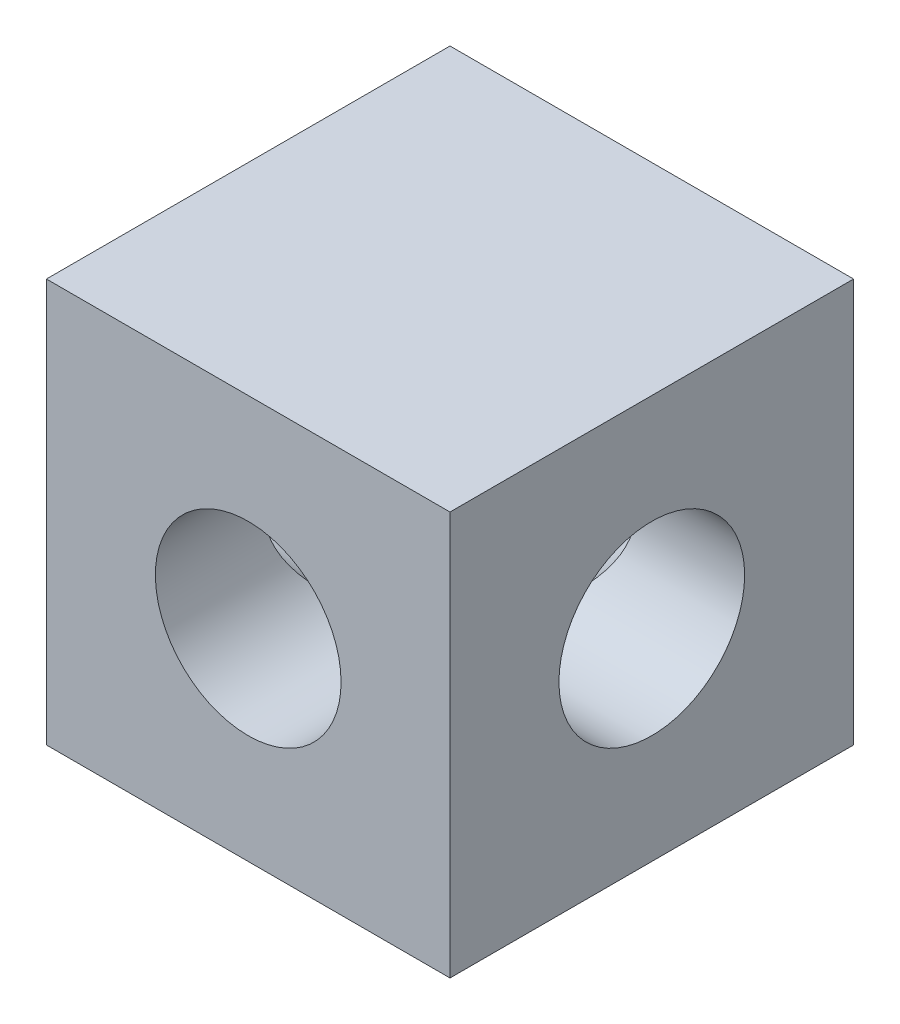
ISO-10303-21;
HEADER;
FILE_DESCRIPTION(('STEP AP214'),'2;1');
FILE_NAME('part.step','',(''),(''),'','','');
FILE_SCHEMA(('AUTOMOTIVE_DESIGN { 1 0 10303 214 1 1 1 1 }'));
ENDSEC;
DATA;
#1=APPLICATION_CONTEXT('core data for automotive mechanical design processes');
#2=APPLICATION_PROTOCOL_DEFINITION('international standard','automotive_design',2000,#1);
#3=PRODUCT_CONTEXT('',#1,'mechanical');
#4=PRODUCT('Part','Part','',(#3));
#5=PRODUCT_RELATED_PRODUCT_CATEGORY('part','',(#4));
#6=PRODUCT_DEFINITION_FORMATION('','',#4);
#7=PRODUCT_DEFINITION_CONTEXT('part definition',#1,'design');
#8=PRODUCT_DEFINITION('design','',#6,#7);
#9=PRODUCT_DEFINITION_SHAPE('','',#8);
#10=(LENGTH_UNIT() NAMED_UNIT(*) SI_UNIT(.MILLI.,.METRE.));
#11=(NAMED_UNIT(*) PLANE_ANGLE_UNIT() SI_UNIT($,.RADIAN.));
#12=(NAMED_UNIT(*) SI_UNIT($,.STERADIAN.) SOLID_ANGLE_UNIT());
#13=UNCERTAINTY_MEASURE_WITH_UNIT(LENGTH_MEASURE(1.E-05),#10,'distance_accuracy_value','');
#14=(GEOMETRIC_REPRESENTATION_CONTEXT(3) GLOBAL_UNCERTAINTY_ASSIGNED_CONTEXT((#13)) GLOBAL_UNIT_ASSIGNED_CONTEXT((#10,
#11,#12)) REPRESENTATION_CONTEXT('',''));
#15=CARTESIAN_POINT('',(0.,0.,0.));
#16=DIRECTION('',(0.,0.,1.));
#17=DIRECTION('',(1.,0.,0.));
#18=AXIS2_PLACEMENT_3D('',#15,#16,#17);
#19=CARTESIAN_POINT('',(0.,0.,20.32));
#20=DIRECTION('',(0.,0.,-1.));
#21=DIRECTION('',(-1.,0.,0.));
#22=AXIS2_PLACEMENT_3D('',#19,#20,#21);
#23=CYLINDRICAL_SURFACE('',#22,4.675);
#24=CARTESIAN_POINT('',(0.,0.,10.16));
#25=DIRECTION('',(0.707106781186547,0.,-0.707106781186547));
#26=DIRECTION('',(-0.707106781186547,0.,-0.707106781186547));
#27=AXIS2_PLACEMENT_3D('',#24,#25,#26);
#28=ELLIPSE('',#27,6.61144840409422,4.675);
#29=CARTESIAN_POINT('',(0.,-4.675,10.16));
#30=VERTEX_POINT('',#29);
#31=CARTESIAN_POINT('',(0.,4.675,10.16));
#32=VERTEX_POINT('',#31);
#33=EDGE_CURVE('E11',#30,#32,#28,.F.);
#34=ORIENTED_EDGE('',*,*,#33,.F.);
#35=CARTESIAN_POINT('',(0.,0.,10.16));
#36=DIRECTION('',(-0.707106781186547,0.,-0.707106781186547));
#37=DIRECTION('',(0.707106781186547,0.,-0.707106781186547));
#38=AXIS2_PLACEMENT_3D('',#35,#36,#37);
#39=ELLIPSE('',#38,6.61144840409422,4.675);
#40=EDGE_CURVE('E47',#32,#30,#39,.F.);
#41=ORIENTED_EDGE('',*,*,#40,.F.);
#42=EDGE_LOOP('',(#34,#41));
#43=FACE_BOUND('',#42,.T.);
#44=CARTESIAN_POINT('',(0.,0.,20.32));
#45=DIRECTION('',(0.,0.,1.));
#46=DIRECTION('',(1.,0.,0.));
#47=AXIS2_PLACEMENT_3D('',#44,#45,#46);
#48=CIRCLE('',#47,4.675);
#49=CARTESIAN_POINT('',(4.675,0.,20.32));
#50=VERTEX_POINT('',#49);
#51=EDGE_CURVE('E122',#50,#50,#48,.T.);
#52=ORIENTED_EDGE('',*,*,#51,.T.);
#53=EDGE_LOOP('',(#52));
#54=FACE_BOUND('',#53,.T.);
#55=ADVANCED_FACE('F33',(#43,#54),#23,.F.);
#56=CARTESIAN_POINT('',(0.,0.,20.32));
#57=DIRECTION('',(0.,0.,1.));
#58=DIRECTION('',(1.,0.,0.));
#59=AXIS2_PLACEMENT_3D('',#56,#57,#58);
#60=PLANE('',#59);
#61=DIRECTION('',(0.,-1.,0.));
#62=VECTOR('',#61,1.);
#63=CARTESIAN_POINT('',(-10.16,-10.16,20.32));
#64=LINE('',#63,#62);
#65=CARTESIAN_POINT('',(-10.16,10.16,20.32));
#66=VERTEX_POINT('',#65);
#67=CARTESIAN_POINT('',(-10.16,-10.16,20.32));
#68=VERTEX_POINT('',#67);
#69=EDGE_CURVE('E114',#66,#68,#64,.T.);
#70=ORIENTED_EDGE('',*,*,#69,.T.);
#71=DIRECTION('',(1.,0.,0.));
#72=VECTOR('',#71,1.);
#73=CARTESIAN_POINT('',(10.16,-10.16,20.32));
#74=LINE('',#73,#72);
#75=CARTESIAN_POINT('',(10.16,-10.16,20.32));
#76=VERTEX_POINT('',#75);
#77=EDGE_CURVE('E85',#68,#76,#74,.T.);
#78=ORIENTED_EDGE('',*,*,#77,.T.);
#79=DIRECTION('',(0.,1.,0.));
#80=VECTOR('',#79,1.);
#81=CARTESIAN_POINT('',(10.16,-10.16,20.32));
#82=LINE('',#81,#80);
#83=CARTESIAN_POINT('',(10.16,10.16,20.32));
#84=VERTEX_POINT('',#83);
#85=EDGE_CURVE('E124',#76,#84,#82,.T.);
#86=ORIENTED_EDGE('',*,*,#85,.T.);
#87=DIRECTION('',(-1.,0.,0.));
#88=VECTOR('',#87,1.);
#89=CARTESIAN_POINT('',(10.16,10.16,20.32));
#90=LINE('',#89,#88);
#91=EDGE_CURVE('E56',#84,#66,#90,.T.);
#92=ORIENTED_EDGE('',*,*,#91,.T.);
#93=EDGE_LOOP('',(#70,#78,#86,#92));
#94=FACE_BOUND('',#93,.T.);
#95=ORIENTED_EDGE('',*,*,#51,.F.);
#96=EDGE_LOOP('',(#95));
#97=FACE_BOUND('',#96,.T.);
#98=ADVANCED_FACE('F150',(#94,#97),#60,.T.);
#99=CARTESIAN_POINT('',(0.,0.,0.));
#100=DIRECTION('',(0.,0.,1.));
#101=DIRECTION('',(1.,0.,0.));
#102=AXIS2_PLACEMENT_3D('',#99,#100,#101);
#103=PLANE('',#102);
#104=DIRECTION('',(0.,-1.,0.));
#105=VECTOR('',#104,1.);
#106=CARTESIAN_POINT('',(-10.16,-10.16,0.));
#107=LINE('',#106,#105);
#108=CARTESIAN_POINT('',(-10.16,10.16,0.));
#109=VERTEX_POINT('',#108);
#110=CARTESIAN_POINT('',(-10.16,-10.16,0.));
#111=VERTEX_POINT('',#110);
#112=EDGE_CURVE('E119',#109,#111,#107,.T.);
#113=ORIENTED_EDGE('',*,*,#112,.F.);
#114=DIRECTION('',(-1.,0.,0.));
#115=VECTOR('',#114,1.);
#116=CARTESIAN_POINT('',(10.16,10.16,0.));
#117=LINE('',#116,#115);
#118=CARTESIAN_POINT('',(10.16,10.16,0.));
#119=VERTEX_POINT('',#118);
#120=EDGE_CURVE('E77',#119,#109,#117,.T.);
#121=ORIENTED_EDGE('',*,*,#120,.F.);
#122=DIRECTION('',(0.,1.,0.));
#123=VECTOR('',#122,1.);
#124=CARTESIAN_POINT('',(10.16,-10.16,0.));
#125=LINE('',#124,#123);
#126=CARTESIAN_POINT('',(10.16,-10.16,0.));
#127=VERTEX_POINT('',#126);
#128=EDGE_CURVE('E115',#127,#119,#125,.T.);
#129=ORIENTED_EDGE('',*,*,#128,.F.);
#130=DIRECTION('',(1.,0.,0.));
#131=VECTOR('',#130,1.);
#132=CARTESIAN_POINT('',(10.16,-10.16,0.));
#133=LINE('',#132,#131);
#134=EDGE_CURVE('E117',#111,#127,#133,.T.);
#135=ORIENTED_EDGE('',*,*,#134,.F.);
#136=EDGE_LOOP('',(#113,#121,#129,#135));
#137=FACE_BOUND('',#136,.T.);
#138=CARTESIAN_POINT('',(0.,0.,0.));
#139=DIRECTION('',(0.,0.,1.));
#140=DIRECTION('',(1.,0.,0.));
#141=AXIS2_PLACEMENT_3D('',#138,#139,#140);
#142=CIRCLE('',#141,4.675);
#143=CARTESIAN_POINT('',(4.675,0.,0.));
#144=VERTEX_POINT('',#143);
#145=EDGE_CURVE('E128',#144,#144,#142,.T.);
#146=ORIENTED_EDGE('',*,*,#145,.T.);
#147=EDGE_LOOP('',(#146));
#148=FACE_BOUND('',#147,.T.);
#149=ADVANCED_FACE('F154',(#137,#148),#103,.F.);
#150=CARTESIAN_POINT('',(-10.16,-10.16,20.32));
#151=DIRECTION('',(1.,0.,0.));
#152=DIRECTION('',(0.,0.,-1.));
#153=AXIS2_PLACEMENT_3D('',#150,#151,#152);
#154=PLANE('',#153);
#155=CARTESIAN_POINT('',(-10.16,0.,10.16));
#156=DIRECTION('',(1.,0.,0.));
#157=DIRECTION('',(0.,0.,-1.));
#158=AXIS2_PLACEMENT_3D('',#155,#156,#157);
#159=CIRCLE('',#158,4.675);
#160=CARTESIAN_POINT('',(-10.16,0.,5.485));
#161=VERTEX_POINT('',#160);
#162=EDGE_CURVE('E131',#161,#161,#159,.T.);
#163=ORIENTED_EDGE('',*,*,#162,.T.);
#164=EDGE_LOOP('',(#163));
#165=FACE_BOUND('',#164,.T.);
#166=ORIENTED_EDGE('',*,*,#112,.T.);
#167=DIRECTION('',(0.,0.,-1.));
#168=VECTOR('',#167,1.);
#169=CARTESIAN_POINT('',(-10.16,-10.16,20.32));
#170=LINE('',#169,#168);
#171=EDGE_CURVE('E99',#68,#111,#170,.T.);
#172=ORIENTED_EDGE('',*,*,#171,.F.);
#173=ORIENTED_EDGE('',*,*,#69,.F.);
#174=DIRECTION('',(0.,0.,-1.));
#175=VECTOR('',#174,1.);
#176=CARTESIAN_POINT('',(-10.16,10.16,20.32));
#177=LINE('',#176,#175);
#178=EDGE_CURVE('E111',#66,#109,#177,.T.);
#179=ORIENTED_EDGE('',*,*,#178,.T.);
#180=EDGE_LOOP('',(#166,#172,#173,#179));
#181=FACE_BOUND('',#180,.T.);
#182=ADVANCED_FACE('F35',(#165,#181),#154,.F.);
#183=CARTESIAN_POINT('',(10.16,-10.16,20.32));
#184=DIRECTION('',(0.,1.,0.));
#185=DIRECTION('',(-1.,0.,0.));
#186=AXIS2_PLACEMENT_3D('',#183,#184,#185);
#187=PLANE('',#186);
#188=ORIENTED_EDGE('',*,*,#134,.T.);
#189=DIRECTION('',(0.,0.,-1.));
#190=VECTOR('',#189,1.);
#191=CARTESIAN_POINT('',(10.16,-10.16,20.32));
#192=LINE('',#191,#190);
#193=EDGE_CURVE('E106',#76,#127,#192,.T.);
#194=ORIENTED_EDGE('',*,*,#193,.F.);
#195=ORIENTED_EDGE('',*,*,#77,.F.);
#196=ORIENTED_EDGE('',*,*,#171,.T.);
#197=EDGE_LOOP('',(#188,#194,#195,#196));
#198=FACE_BOUND('',#197,.T.);
#199=ADVANCED_FACE('F164',(#198),#187,.F.);
#200=CARTESIAN_POINT('',(10.16,-10.16,20.32));
#201=DIRECTION('',(-1.,0.,0.));
#202=DIRECTION('',(0.,0.,1.));
#203=AXIS2_PLACEMENT_3D('',#200,#201,#202);
#204=PLANE('',#203);
#205=CARTESIAN_POINT('',(10.16,0.,10.16));
#206=DIRECTION('',(1.,0.,0.));
#207=DIRECTION('',(0.,0.,-1.));
#208=AXIS2_PLACEMENT_3D('',#205,#206,#207);
#209=CIRCLE('',#208,4.675);
#210=CARTESIAN_POINT('',(10.16,0.,5.485));
#211=VERTEX_POINT('',#210);
#212=EDGE_CURVE('E134',#211,#211,#209,.T.);
#213=ORIENTED_EDGE('',*,*,#212,.F.);
#214=EDGE_LOOP('',(#213));
#215=FACE_BOUND('',#214,.T.);
#216=ORIENTED_EDGE('',*,*,#128,.T.);
#217=DIRECTION('',(0.,0.,-1.));
#218=VECTOR('',#217,1.);
#219=CARTESIAN_POINT('',(10.16,10.16,20.32));
#220=LINE('',#219,#218);
#221=EDGE_CURVE('E109',#84,#119,#220,.T.);
#222=ORIENTED_EDGE('',*,*,#221,.F.);
#223=ORIENTED_EDGE('',*,*,#85,.F.);
#224=ORIENTED_EDGE('',*,*,#193,.T.);
#225=EDGE_LOOP('',(#216,#222,#223,#224));
#226=FACE_BOUND('',#225,.T.);
#227=ADVANCED_FACE('F162',(#215,#226),#204,.F.);
#228=CARTESIAN_POINT('',(10.16,10.16,20.32));
#229=DIRECTION('',(0.,-1.,0.));
#230=DIRECTION('',(1.,0.,0.));
#231=AXIS2_PLACEMENT_3D('',#228,#229,#230);
#232=PLANE('',#231);
#233=ORIENTED_EDGE('',*,*,#120,.T.);
#234=ORIENTED_EDGE('',*,*,#178,.F.);
#235=ORIENTED_EDGE('',*,*,#91,.F.);
#236=ORIENTED_EDGE('',*,*,#221,.T.);
#237=EDGE_LOOP('',(#233,#234,#235,#236));
#238=FACE_BOUND('',#237,.T.);
#239=ADVANCED_FACE('F147',(#238),#232,.F.);
#240=CARTESIAN_POINT('',(0.,0.,10.16));
#241=DIRECTION('',(0.707106781186547,0.,-0.707106781186547));
#242=DIRECTION('',(-0.707106781186547,0.,-0.707106781186547));
#243=AXIS2_PLACEMENT_3D('',#240,#241,#242);
#244=ELLIPSE('',#243,6.61144840409422,4.675);
#245=EDGE_CURVE('E41',#30,#32,#244,.T.);
#246=ORIENTED_EDGE('',*,*,#245,.F.);
#247=CARTESIAN_POINT('',(0.,0.,10.16));
#248=DIRECTION('',(-0.707106781186547,0.,-0.707106781186547));
#249=DIRECTION('',(0.707106781186547,0.,-0.707106781186547));
#250=AXIS2_PLACEMENT_3D('',#247,#248,#249);
#251=ELLIPSE('',#250,6.61144840409422,4.675);
#252=EDGE_CURVE('E90',#32,#30,#251,.T.);
#253=ORIENTED_EDGE('',*,*,#252,.F.);
#254=EDGE_LOOP('',(#246,#253));
#255=FACE_BOUND('',#254,.T.);
#256=ORIENTED_EDGE('',*,*,#145,.F.);
#257=EDGE_LOOP('',(#256));
#258=FACE_BOUND('',#257,.T.);
#259=ADVANCED_FACE('F102',(#255,#258),#23,.F.);
#260=CARTESIAN_POINT('',(-10.16,0.,10.16));
#261=DIRECTION('',(1.,0.,0.));
#262=DIRECTION('',(0.,0.,-1.));
#263=AXIS2_PLACEMENT_3D('',#260,#261,#262);
#264=CYLINDRICAL_SURFACE('',#263,4.675);
#265=ORIENTED_EDGE('',*,*,#245,.T.);
#266=ORIENTED_EDGE('',*,*,#40,.T.);
#267=EDGE_LOOP('',(#265,#266));
#268=FACE_BOUND('',#267,.T.);
#269=ORIENTED_EDGE('',*,*,#162,.F.);
#270=EDGE_LOOP('',(#269));
#271=FACE_BOUND('',#270,.T.);
#272=ADVANCED_FACE('F97',(#268,#271),#264,.F.);
#273=ORIENTED_EDGE('',*,*,#33,.T.);
#274=ORIENTED_EDGE('',*,*,#252,.T.);
#275=EDGE_LOOP('',(#273,#274));
#276=FACE_BOUND('',#275,.T.);
#277=ORIENTED_EDGE('',*,*,#212,.T.);
#278=EDGE_LOOP('',(#277));
#279=FACE_BOUND('',#278,.T.);
#280=ADVANCED_FACE('F91',(#276,#279),#264,.F.);
#281=CLOSED_SHELL('',(#55,#98,#149,#182,#199,#227,#239,#259,#272,#280));
#282=MANIFOLD_SOLID_BREP('B2',#281);
#283=ADVANCED_BREP_SHAPE_REPRESENTATION('',(#18,#282),#14);
#284=SHAPE_DEFINITION_REPRESENTATION(#9,#283);
ENDSEC;
END-ISO-10303-21;
